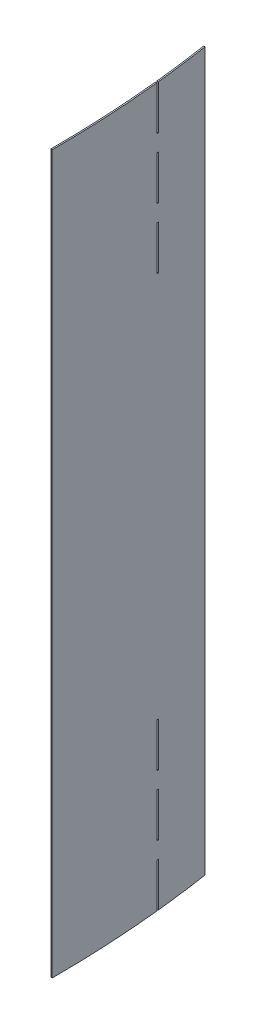
ISO-10303-21;
HEADER;
FILE_DESCRIPTION(('STEP AP214'),'2;1');
FILE_NAME('part.step','',(''),(''),'','','');
FILE_SCHEMA(('AUTOMOTIVE_DESIGN { 1 0 10303 214 1 1 1 1 }'));
ENDSEC;
DATA;
#1=APPLICATION_CONTEXT('core data for automotive mechanical design processes');
#2=APPLICATION_PROTOCOL_DEFINITION('international standard','automotive_design',2000,#1);
#3=PRODUCT_CONTEXT('',#1,'mechanical');
#4=PRODUCT('Part','Part','',(#3));
#5=PRODUCT_RELATED_PRODUCT_CATEGORY('part','',(#4));
#6=PRODUCT_DEFINITION_FORMATION('','',#4);
#7=PRODUCT_DEFINITION_CONTEXT('part definition',#1,'design');
#8=PRODUCT_DEFINITION('design','',#6,#7);
#9=PRODUCT_DEFINITION_SHAPE('','',#8);
#10=(LENGTH_UNIT() NAMED_UNIT(*) SI_UNIT(.MILLI.,.METRE.));
#11=(NAMED_UNIT(*) PLANE_ANGLE_UNIT() SI_UNIT($,.RADIAN.));
#12=(NAMED_UNIT(*) SI_UNIT($,.STERADIAN.) SOLID_ANGLE_UNIT());
#13=UNCERTAINTY_MEASURE_WITH_UNIT(LENGTH_MEASURE(1.E-05),#10,'distance_accuracy_value','');
#14=(GEOMETRIC_REPRESENTATION_CONTEXT(3) GLOBAL_UNCERTAINTY_ASSIGNED_CONTEXT((#13)) GLOBAL_UNIT_ASSIGNED_CONTEXT((#10,
#11,#12)) REPRESENTATION_CONTEXT('',''));
#15=CARTESIAN_POINT('',(0.,0.,0.));
#16=DIRECTION('',(0.,0.,1.));
#17=DIRECTION('',(1.,0.,0.));
#18=AXIS2_PLACEMENT_3D('',#15,#16,#17);
#19=CARTESIAN_POINT('',(194.448352042331,115.,-20.2506392003287));
#20=DIRECTION('',(-0.103583832226745,0.,-0.994620726559236));
#21=DIRECTION('',(0.,1.,0.));
#22=AXIS2_PLACEMENT_3D('',#19,#20,#21);
#23=PLANE('',#22);
#24=DIRECTION('',(-0.994620726559236,0.,0.103583832226745));
#25=VECTOR('',#24,1.);
#26=CARTESIAN_POINT('',(194.448352042331,111.,-20.2506392003287));
#27=LINE('',#26,#25);
#28=CARTESIAN_POINT('',(194.69700722397,111.,-20.2765351583854));
#29=VERTEX_POINT('',#28);
#30=CARTESIAN_POINT('',(194.448352042331,111.,-20.2506392003287));
#31=VERTEX_POINT('',#30);
#32=EDGE_CURVE('E11',#29,#31,#27,.T.);
#33=ORIENTED_EDGE('',*,*,#32,.F.);
#34=DIRECTION('',(0.,-1.,0.));
#35=VECTOR('',#34,1.);
#36=CARTESIAN_POINT('',(194.69700722397,198.448032274868,-20.2765351583854));
#37=LINE('',#36,#35);
#38=CARTESIAN_POINT('',(194.69700722397,119.,-20.2765351583854));
#39=VERTEX_POINT('',#38);
#40=EDGE_CURVE('E147',#29,#39,#37,.F.);
#41=ORIENTED_EDGE('',*,*,#40,.T.);
#42=DIRECTION('',(-0.994620726559236,0.,0.103583832226745));
#43=VECTOR('',#42,1.);
#44=CARTESIAN_POINT('',(194.448352042331,119.,-20.2506392003287));
#45=LINE('',#44,#43);
#46=CARTESIAN_POINT('',(194.448352042331,119.,-20.2506392003287));
#47=VERTEX_POINT('',#46);
#48=EDGE_CURVE('E49',#39,#47,#45,.T.);
#49=ORIENTED_EDGE('',*,*,#48,.T.);
#50=DIRECTION('',(0.,1.,0.));
#51=VECTOR('',#50,1.);
#52=CARTESIAN_POINT('',(194.448352042331,119.,-20.2506392003287));
#53=LINE('',#52,#51);
#54=EDGE_CURVE('E150',#31,#47,#53,.T.);
#55=ORIENTED_EDGE('',*,*,#54,.F.);
#56=EDGE_LOOP('',(#33,#41,#49,#55));
#57=FACE_BOUND('',#56,.T.);
#58=ADVANCED_FACE('F39',(#57),#23,.F.);
#59=CARTESIAN_POINT('',(0.,119.,0.));
#60=DIRECTION('',(0.,1.,0.));
#61=DIRECTION('',(0.,0.,1.));
#62=AXIS2_PLACEMENT_3D('',#59,#60,#61);
#63=PLANE('',#62);
#64=ORIENTED_EDGE('',*,*,#48,.F.);
#65=CARTESIAN_POINT('',(0.,119.,0.));
#66=DIRECTION('',(0.,-1.,0.));
#67=DIRECTION('',(0.,0.,-1.));
#68=AXIS2_PLACEMENT_3D('',#65,#66,#67);
#69=CIRCLE('',#68,195.75);
#70=CARTESIAN_POINT('',(194.727873277082,119.,-19.9779345525165));
#71=VERTEX_POINT('',#70);
#72=EDGE_CURVE('E162',#39,#71,#69,.T.);
#73=ORIENTED_EDGE('',*,*,#72,.T.);
#74=DIRECTION('',(-0.994778407545758,0.,0.102058414061387));
#75=VECTOR('',#74,1.);
#76=CARTESIAN_POINT('',(194.479178675196,119.,-19.9524199490011));
#77=LINE('',#76,#75);
#78=CARTESIAN_POINT('',(194.479178675196,119.,-19.9524199490011));
#79=VERTEX_POINT('',#78);
#80=EDGE_CURVE('E247',#71,#79,#77,.T.);
#81=ORIENTED_EDGE('',*,*,#80,.T.);
#82=CARTESIAN_POINT('',(0.,119.,0.));
#83=DIRECTION('',(0.,-1.,0.));
#84=DIRECTION('',(0.,0.,1.));
#85=AXIS2_PLACEMENT_3D('',#82,#83,#84);
#86=CIRCLE('',#85,195.5);
#87=EDGE_CURVE('E254',#47,#79,#86,.T.);
#88=ORIENTED_EDGE('',*,*,#87,.F.);
#89=EDGE_LOOP('',(#64,#73,#81,#88));
#90=FACE_BOUND('',#89,.T.);
#91=ADVANCED_FACE('F257',(#90),#63,.F.);
#92=CARTESIAN_POINT('',(194.479178675196,115.,-19.9524199490011));
#93=DIRECTION('',(0.102058414061387,0.,0.994778407545758));
#94=DIRECTION('',(0.,-1.,0.));
#95=AXIS2_PLACEMENT_3D('',#92,#93,#94);
#96=PLANE('',#95);
#97=ORIENTED_EDGE('',*,*,#80,.F.);
#98=DIRECTION('',(0.,-1.,0.));
#99=VECTOR('',#98,1.);
#100=CARTESIAN_POINT('',(194.727873277082,198.448032274868,-19.9779345525165));
#101=LINE('',#100,#99);
#102=CARTESIAN_POINT('',(194.727873277082,111.,-19.9779345525165));
#103=VERTEX_POINT('',#102);
#104=EDGE_CURVE('E166',#71,#103,#101,.T.);
#105=ORIENTED_EDGE('',*,*,#104,.T.);
#106=DIRECTION('',(-0.994778407545758,0.,0.102058414061387));
#107=VECTOR('',#106,1.);
#108=CARTESIAN_POINT('',(194.479178675196,111.,-19.9524199490011));
#109=LINE('',#108,#107);
#110=CARTESIAN_POINT('',(194.479178675196,111.,-19.9524199490011));
#111=VERTEX_POINT('',#110);
#112=EDGE_CURVE('E43',#103,#111,#109,.T.);
#113=ORIENTED_EDGE('',*,*,#112,.T.);
#114=DIRECTION('',(0.,-1.,0.));
#115=VECTOR('',#114,1.);
#116=CARTESIAN_POINT('',(194.479178675196,111.,-19.9524199490011));
#117=LINE('',#116,#115);
#118=EDGE_CURVE('E258',#79,#111,#117,.T.);
#119=ORIENTED_EDGE('',*,*,#118,.F.);
#120=EDGE_LOOP('',(#97,#105,#113,#119));
#121=FACE_BOUND('',#120,.T.);
#122=ADVANCED_FACE('F509',(#121),#96,.F.);
#123=CARTESIAN_POINT('',(194.448352042331,104.,-20.2506392003287));
#124=DIRECTION('',(-0.103583832226745,0.,-0.994620726559236));
#125=DIRECTION('',(0.,1.,0.));
#126=AXIS2_PLACEMENT_3D('',#123,#124,#125);
#127=PLANE('',#126);
#128=DIRECTION('',(-0.994620726559236,0.,0.103583832226745));
#129=VECTOR('',#128,1.);
#130=CARTESIAN_POINT('',(194.448352042331,100.,-20.2506392003287));
#131=LINE('',#130,#129);
#132=CARTESIAN_POINT('',(194.69700722397,100.,-20.2765351583854));
#133=VERTEX_POINT('',#132);
#134=CARTESIAN_POINT('',(194.448352042331,100.,-20.2506392003287));
#135=VERTEX_POINT('',#134);
#136=EDGE_CURVE('E242',#133,#135,#131,.T.);
#137=ORIENTED_EDGE('',*,*,#136,.F.);
#138=DIRECTION('',(0.,-1.,0.));
#139=VECTOR('',#138,1.);
#140=CARTESIAN_POINT('',(194.69700722397,198.448032274868,-20.2765351583854));
#141=LINE('',#140,#139);
#142=CARTESIAN_POINT('',(194.69700722397,108.,-20.2765351583854));
#143=VERTEX_POINT('',#142);
#144=EDGE_CURVE('E324',#133,#143,#141,.F.);
#145=ORIENTED_EDGE('',*,*,#144,.T.);
#146=DIRECTION('',(-0.994620726559236,0.,0.103583832226745));
#147=VECTOR('',#146,1.);
#148=CARTESIAN_POINT('',(194.448352042331,108.,-20.2506392003287));
#149=LINE('',#148,#147);
#150=CARTESIAN_POINT('',(194.448352042331,108.,-20.2506392003287));
#151=VERTEX_POINT('',#150);
#152=EDGE_CURVE('E239',#143,#151,#149,.T.);
#153=ORIENTED_EDGE('',*,*,#152,.T.);
#154=DIRECTION('',(0.,1.,0.));
#155=VECTOR('',#154,1.);
#156=CARTESIAN_POINT('',(194.448352042331,108.,-20.2506392003287));
#157=LINE('',#156,#155);
#158=EDGE_CURVE('E348',#135,#151,#157,.T.);
#159=ORIENTED_EDGE('',*,*,#158,.F.);
#160=EDGE_LOOP('',(#137,#145,#153,#159));
#161=FACE_BOUND('',#160,.T.);
#162=ADVANCED_FACE('F345',(#161),#127,.F.);
#163=CARTESIAN_POINT('',(0.,108.,0.));
#164=DIRECTION('',(0.,1.,0.));
#165=DIRECTION('',(0.,0.,1.));
#166=AXIS2_PLACEMENT_3D('',#163,#164,#165);
#167=PLANE('',#166);
#168=ORIENTED_EDGE('',*,*,#152,.F.);
#169=CARTESIAN_POINT('',(0.,108.,0.));
#170=DIRECTION('',(0.,-1.,0.));
#171=DIRECTION('',(0.,0.,-1.));
#172=AXIS2_PLACEMENT_3D('',#169,#170,#171);
#173=CIRCLE('',#172,195.75);
#174=CARTESIAN_POINT('',(194.727873277082,108.,-19.9779345525165));
#175=VERTEX_POINT('',#174);
#176=EDGE_CURVE('E328',#143,#175,#173,.T.);
#177=ORIENTED_EDGE('',*,*,#176,.T.);
#178=DIRECTION('',(-0.994778407545758,0.,0.102058414061387));
#179=VECTOR('',#178,1.);
#180=CARTESIAN_POINT('',(194.479178675196,108.,-19.9524199490011));
#181=LINE('',#180,#179);
#182=CARTESIAN_POINT('',(194.479178675196,108.,-19.9524199490011));
#183=VERTEX_POINT('',#182);
#184=EDGE_CURVE('E236',#175,#183,#181,.T.);
#185=ORIENTED_EDGE('',*,*,#184,.T.);
#186=CARTESIAN_POINT('',(0.,108.,0.));
#187=DIRECTION('',(0.,-1.,0.));
#188=DIRECTION('',(0.,0.,1.));
#189=AXIS2_PLACEMENT_3D('',#186,#187,#188);
#190=CIRCLE('',#189,195.5);
#191=EDGE_CURVE('E355',#151,#183,#190,.T.);
#192=ORIENTED_EDGE('',*,*,#191,.F.);
#193=EDGE_LOOP('',(#168,#177,#185,#192));
#194=FACE_BOUND('',#193,.T.);
#195=ADVANCED_FACE('F519',(#194),#167,.F.);
#196=CARTESIAN_POINT('',(194.479178675196,104.,-19.9524199490011));
#197=DIRECTION('',(0.102058414061387,0.,0.994778407545758));
#198=DIRECTION('',(0.,-1.,0.));
#199=AXIS2_PLACEMENT_3D('',#196,#197,#198);
#200=PLANE('',#199);
#201=ORIENTED_EDGE('',*,*,#184,.F.);
#202=DIRECTION('',(0.,-1.,0.));
#203=VECTOR('',#202,1.);
#204=CARTESIAN_POINT('',(194.727873277082,198.448032274868,-19.9779345525165));
#205=LINE('',#204,#203);
#206=CARTESIAN_POINT('',(194.727873277082,100.,-19.9779345525165));
#207=VERTEX_POINT('',#206);
#208=EDGE_CURVE('E325',#175,#207,#205,.T.);
#209=ORIENTED_EDGE('',*,*,#208,.T.);
#210=DIRECTION('',(-0.994778407545758,0.,0.102058414061387));
#211=VECTOR('',#210,1.);
#212=CARTESIAN_POINT('',(194.479178675196,100.,-19.9524199490011));
#213=LINE('',#212,#211);
#214=CARTESIAN_POINT('',(194.479178675196,100.,-19.9524199490011));
#215=VERTEX_POINT('',#214);
#216=EDGE_CURVE('E233',#207,#215,#213,.T.);
#217=ORIENTED_EDGE('',*,*,#216,.T.);
#218=DIRECTION('',(0.,-1.,0.));
#219=VECTOR('',#218,1.);
#220=CARTESIAN_POINT('',(194.479178675196,100.,-19.9524199490011));
#221=LINE('',#220,#219);
#222=EDGE_CURVE('E361',#183,#215,#221,.T.);
#223=ORIENTED_EDGE('',*,*,#222,.F.);
#224=EDGE_LOOP('',(#201,#209,#217,#223));
#225=FACE_BOUND('',#224,.T.);
#226=ADVANCED_FACE('F522',(#225),#200,.F.);
#227=CARTESIAN_POINT('',(194.448352042331,26.,-20.2506392003287));
#228=DIRECTION('',(-0.103583832226745,0.,-0.994620726559236));
#229=DIRECTION('',(0.,1.,0.));
#230=AXIS2_PLACEMENT_3D('',#227,#228,#229);
#231=PLANE('',#230);
#232=DIRECTION('',(-0.994620726559236,0.,0.103583832226745));
#233=VECTOR('',#232,1.);
#234=CARTESIAN_POINT('',(194.448352042331,22.,-20.2506392003287));
#235=LINE('',#234,#233);
#236=CARTESIAN_POINT('',(194.69700722397,22.,-20.2765351583854));
#237=VERTEX_POINT('',#236);
#238=CARTESIAN_POINT('',(194.448352042331,22.,-20.2506392003287));
#239=VERTEX_POINT('',#238);
#240=EDGE_CURVE('E230',#237,#239,#235,.T.);
#241=ORIENTED_EDGE('',*,*,#240,.F.);
#242=DIRECTION('',(0.,-1.,0.));
#243=VECTOR('',#242,1.);
#244=CARTESIAN_POINT('',(194.69700722397,198.448032274868,-20.2765351583854));
#245=LINE('',#244,#243);
#246=CARTESIAN_POINT('',(194.69700722397,30.,-20.2765351583854));
#247=VERTEX_POINT('',#246);
#248=EDGE_CURVE('E312',#237,#247,#245,.F.);
#249=ORIENTED_EDGE('',*,*,#248,.T.);
#250=DIRECTION('',(-0.994620726559236,0.,0.103583832226745));
#251=VECTOR('',#250,1.);
#252=CARTESIAN_POINT('',(194.448352042331,30.,-20.2506392003287));
#253=LINE('',#252,#251);
#254=CARTESIAN_POINT('',(194.448352042331,30.,-20.2506392003287));
#255=VERTEX_POINT('',#254);
#256=EDGE_CURVE('E227',#247,#255,#253,.T.);
#257=ORIENTED_EDGE('',*,*,#256,.T.);
#258=DIRECTION('',(0.,1.,0.));
#259=VECTOR('',#258,1.);
#260=CARTESIAN_POINT('',(194.448352042331,30.,-20.2506392003287));
#261=LINE('',#260,#259);
#262=EDGE_CURVE('E373',#239,#255,#261,.T.);
#263=ORIENTED_EDGE('',*,*,#262,.F.);
#264=EDGE_LOOP('',(#241,#249,#257,#263));
#265=FACE_BOUND('',#264,.T.);
#266=ADVANCED_FACE('F526',(#265),#231,.F.);
#267=CARTESIAN_POINT('',(0.,30.,0.));
#268=DIRECTION('',(0.,1.,0.));
#269=DIRECTION('',(0.,0.,1.));
#270=AXIS2_PLACEMENT_3D('',#267,#268,#269);
#271=PLANE('',#270);
#272=ORIENTED_EDGE('',*,*,#256,.F.);
#273=CARTESIAN_POINT('',(0.,30.,0.));
#274=DIRECTION('',(0.,-1.,0.));
#275=DIRECTION('',(0.,0.,-1.));
#276=AXIS2_PLACEMENT_3D('',#273,#274,#275);
#277=CIRCLE('',#276,195.75);
#278=CARTESIAN_POINT('',(194.727873277082,30.,-19.9779345525165));
#279=VERTEX_POINT('',#278);
#280=EDGE_CURVE('E317',#247,#279,#277,.T.);
#281=ORIENTED_EDGE('',*,*,#280,.T.);
#282=DIRECTION('',(-0.994778407545758,0.,0.102058414061387));
#283=VECTOR('',#282,1.);
#284=CARTESIAN_POINT('',(194.479178675196,30.,-19.9524199490011));
#285=LINE('',#284,#283);
#286=CARTESIAN_POINT('',(194.479178675196,30.,-19.9524199490011));
#287=VERTEX_POINT('',#286);
#288=EDGE_CURVE('E224',#279,#287,#285,.T.);
#289=ORIENTED_EDGE('',*,*,#288,.T.);
#290=CARTESIAN_POINT('',(0.,30.,0.));
#291=DIRECTION('',(0.,-1.,0.));
#292=DIRECTION('',(0.,0.,1.));
#293=AXIS2_PLACEMENT_3D('',#290,#291,#292);
#294=CIRCLE('',#293,195.5);
#295=EDGE_CURVE('E370',#255,#287,#294,.T.);
#296=ORIENTED_EDGE('',*,*,#295,.F.);
#297=EDGE_LOOP('',(#272,#281,#289,#296));
#298=FACE_BOUND('',#297,.T.);
#299=ADVANCED_FACE('F534',(#298),#271,.F.);
#300=CARTESIAN_POINT('',(194.479178675196,26.,-19.9524199490011));
#301=DIRECTION('',(0.102058414061387,0.,0.994778407545758));
#302=DIRECTION('',(0.,-1.,0.));
#303=AXIS2_PLACEMENT_3D('',#300,#301,#302);
#304=PLANE('',#303);
#305=ORIENTED_EDGE('',*,*,#288,.F.);
#306=DIRECTION('',(0.,-1.,0.));
#307=VECTOR('',#306,1.);
#308=CARTESIAN_POINT('',(194.727873277082,198.448032274868,-19.9779345525165));
#309=LINE('',#308,#307);
#310=CARTESIAN_POINT('',(194.727873277082,22.,-19.9779345525165));
#311=VERTEX_POINT('',#310);
#312=EDGE_CURVE('E313',#279,#311,#309,.T.);
#313=ORIENTED_EDGE('',*,*,#312,.T.);
#314=DIRECTION('',(-0.994778407545758,0.,0.102058414061387));
#315=VECTOR('',#314,1.);
#316=CARTESIAN_POINT('',(194.479178675196,22.,-19.9524199490011));
#317=LINE('',#316,#315);
#318=CARTESIAN_POINT('',(194.479178675196,22.,-19.9524199490011));
#319=VERTEX_POINT('',#318);
#320=EDGE_CURVE('E221',#311,#319,#317,.T.);
#321=ORIENTED_EDGE('',*,*,#320,.T.);
#322=DIRECTION('',(0.,-1.,0.));
#323=VECTOR('',#322,1.);
#324=CARTESIAN_POINT('',(194.479178675196,22.,-19.9524199490011));
#325=LINE('',#324,#323);
#326=EDGE_CURVE('E367',#287,#319,#325,.T.);
#327=ORIENTED_EDGE('',*,*,#326,.F.);
#328=EDGE_LOOP('',(#305,#313,#321,#327));
#329=FACE_BOUND('',#328,.T.);
#330=ADVANCED_FACE('F538',(#329),#304,.F.);
#331=CARTESIAN_POINT('',(194.448352042331,15.,-20.2506392003287));
#332=DIRECTION('',(-0.103583832226745,0.,-0.994620726559236));
#333=DIRECTION('',(0.,1.,0.));
#334=AXIS2_PLACEMENT_3D('',#331,#332,#333);
#335=PLANE('',#334);
#336=DIRECTION('',(-0.994620726559236,0.,0.103583832226745));
#337=VECTOR('',#336,1.);
#338=CARTESIAN_POINT('',(194.448352042331,11.,-20.2506392003287));
#339=LINE('',#338,#337);
#340=CARTESIAN_POINT('',(194.69700722397,11.,-20.2765351583854));
#341=VERTEX_POINT('',#340);
#342=CARTESIAN_POINT('',(194.448352042331,11.,-20.2506392003287));
#343=VERTEX_POINT('',#342);
#344=EDGE_CURVE('E218',#341,#343,#339,.T.);
#345=ORIENTED_EDGE('',*,*,#344,.F.);
#346=DIRECTION('',(0.,-1.,0.));
#347=VECTOR('',#346,1.);
#348=CARTESIAN_POINT('',(194.69700722397,198.448032274868,-20.2765351583854));
#349=LINE('',#348,#347);
#350=CARTESIAN_POINT('',(194.69700722397,19.,-20.2765351583854));
#351=VERTEX_POINT('',#350);
#352=EDGE_CURVE('E300',#341,#351,#349,.F.);
#353=ORIENTED_EDGE('',*,*,#352,.T.);
#354=DIRECTION('',(-0.994620726559236,0.,0.103583832226745));
#355=VECTOR('',#354,1.);
#356=CARTESIAN_POINT('',(194.448352042331,19.,-20.2506392003287));
#357=LINE('',#356,#355);
#358=CARTESIAN_POINT('',(194.448352042331,19.,-20.2506392003287));
#359=VERTEX_POINT('',#358);
#360=EDGE_CURVE('E215',#351,#359,#357,.T.);
#361=ORIENTED_EDGE('',*,*,#360,.T.);
#362=DIRECTION('',(0.,1.,0.));
#363=VECTOR('',#362,1.);
#364=CARTESIAN_POINT('',(194.448352042331,19.,-20.2506392003287));
#365=LINE('',#364,#363);
#366=EDGE_CURVE('E385',#343,#359,#365,.T.);
#367=ORIENTED_EDGE('',*,*,#366,.F.);
#368=EDGE_LOOP('',(#345,#353,#361,#367));
#369=FACE_BOUND('',#368,.T.);
#370=ADVANCED_FACE('F542',(#369),#335,.F.);
#371=CARTESIAN_POINT('',(0.,19.,0.));
#372=DIRECTION('',(0.,1.,0.));
#373=DIRECTION('',(0.,0.,1.));
#374=AXIS2_PLACEMENT_3D('',#371,#372,#373);
#375=PLANE('',#374);
#376=ORIENTED_EDGE('',*,*,#360,.F.);
#377=CARTESIAN_POINT('',(0.,19.,0.));
#378=DIRECTION('',(0.,-1.,0.));
#379=DIRECTION('',(0.,0.,-1.));
#380=AXIS2_PLACEMENT_3D('',#377,#378,#379);
#381=CIRCLE('',#380,195.75);
#382=CARTESIAN_POINT('',(194.727873277082,19.,-19.9779345525165));
#383=VERTEX_POINT('',#382);
#384=EDGE_CURVE('E305',#351,#383,#381,.T.);
#385=ORIENTED_EDGE('',*,*,#384,.T.);
#386=DIRECTION('',(-0.994778407545758,0.,0.102058414061387));
#387=VECTOR('',#386,1.);
#388=CARTESIAN_POINT('',(194.479178675196,19.,-19.9524199490011));
#389=LINE('',#388,#387);
#390=CARTESIAN_POINT('',(194.479178675196,19.,-19.9524199490011));
#391=VERTEX_POINT('',#390);
#392=EDGE_CURVE('E212',#383,#391,#389,.T.);
#393=ORIENTED_EDGE('',*,*,#392,.T.);
#394=CARTESIAN_POINT('',(0.,19.,0.));
#395=DIRECTION('',(0.,-1.,0.));
#396=DIRECTION('',(0.,0.,1.));
#397=AXIS2_PLACEMENT_3D('',#394,#395,#396);
#398=CIRCLE('',#397,195.5);
#399=EDGE_CURVE('E382',#359,#391,#398,.T.);
#400=ORIENTED_EDGE('',*,*,#399,.F.);
#401=EDGE_LOOP('',(#376,#385,#393,#400));
#402=FACE_BOUND('',#401,.T.);
#403=ADVANCED_FACE('F549',(#402),#375,.F.);
#404=CARTESIAN_POINT('',(194.479178675196,15.,-19.9524199490011));
#405=DIRECTION('',(0.102058414061387,0.,0.994778407545758));
#406=DIRECTION('',(0.,-1.,0.));
#407=AXIS2_PLACEMENT_3D('',#404,#405,#406);
#408=PLANE('',#407);
#409=ORIENTED_EDGE('',*,*,#392,.F.);
#410=DIRECTION('',(0.,-1.,0.));
#411=VECTOR('',#410,1.);
#412=CARTESIAN_POINT('',(194.727873277082,198.448032274868,-19.9779345525165));
#413=LINE('',#412,#411);
#414=CARTESIAN_POINT('',(194.727873277082,11.,-19.9779345525165));
#415=VERTEX_POINT('',#414);
#416=EDGE_CURVE('E301',#383,#415,#413,.T.);
#417=ORIENTED_EDGE('',*,*,#416,.T.);
#418=DIRECTION('',(-0.994778407545758,0.,0.102058414061387));
#419=VECTOR('',#418,1.);
#420=CARTESIAN_POINT('',(194.479178675196,11.,-19.9524199490011));
#421=LINE('',#420,#419);
#422=CARTESIAN_POINT('',(194.479178675196,11.,-19.9524199490011));
#423=VERTEX_POINT('',#422);
#424=EDGE_CURVE('E208',#415,#423,#421,.T.);
#425=ORIENTED_EDGE('',*,*,#424,.T.);
#426=DIRECTION('',(0.,-1.,0.));
#427=VECTOR('',#426,1.);
#428=CARTESIAN_POINT('',(194.479178675196,11.,-19.9524199490011));
#429=LINE('',#428,#427);
#430=EDGE_CURVE('E379',#391,#423,#429,.T.);
#431=ORIENTED_EDGE('',*,*,#430,.F.);
#432=EDGE_LOOP('',(#409,#417,#425,#431));
#433=FACE_BOUND('',#432,.T.);
#434=ADVANCED_FACE('F503',(#433),#408,.F.);
#435=CARTESIAN_POINT('',(194.448352042331,4.,-20.2506392003287));
#436=DIRECTION('',(-0.103583832226745,0.,-0.994620726559236));
#437=DIRECTION('',(0.,1.,0.));
#438=AXIS2_PLACEMENT_3D('',#435,#436,#437);
#439=PLANE('',#438);
#440=DIRECTION('',(-0.994620726559236,0.,0.103583832226745));
#441=VECTOR('',#440,1.);
#442=CARTESIAN_POINT('',(194.448352042331,0.,-20.2506392003287));
#443=LINE('',#442,#441);
#444=CARTESIAN_POINT('',(194.69700722397,0.,-20.2765351583854));
#445=VERTEX_POINT('',#444);
#446=CARTESIAN_POINT('',(194.448352042331,0.,-20.2506392003287));
#447=VERTEX_POINT('',#446);
#448=EDGE_CURVE('E205',#445,#447,#443,.T.);
#449=ORIENTED_EDGE('',*,*,#448,.F.);
#450=DIRECTION('',(0.,-1.,0.));
#451=VECTOR('',#450,1.);
#452=CARTESIAN_POINT('',(194.69700722397,198.448032274868,-20.2765351583854));
#453=LINE('',#452,#451);
#454=CARTESIAN_POINT('',(194.69700722397,8.00000000000001,-20.2765351583854));
#455=VERTEX_POINT('',#454);
#456=EDGE_CURVE('E295',#445,#455,#453,.F.);
#457=ORIENTED_EDGE('',*,*,#456,.T.);
#458=DIRECTION('',(-0.994620726559236,0.,0.103583832226745));
#459=VECTOR('',#458,1.);
#460=CARTESIAN_POINT('',(194.448352042331,8.00000000000001,-20.2506392003287));
#461=LINE('',#460,#459);
#462=CARTESIAN_POINT('',(194.448352042331,8.00000000000001,-20.2506392003287));
#463=VERTEX_POINT('',#462);
#464=EDGE_CURVE('E202',#455,#463,#461,.T.);
#465=ORIENTED_EDGE('',*,*,#464,.T.);
#466=DIRECTION('',(0.,1.,0.));
#467=VECTOR('',#466,1.);
#468=CARTESIAN_POINT('',(194.448352042331,8.00000000000001,-20.2506392003287));
#469=LINE('',#468,#467);
#470=EDGE_CURVE('E165',#447,#463,#469,.T.);
#471=ORIENTED_EDGE('',*,*,#470,.F.);
#472=EDGE_LOOP('',(#449,#457,#465,#471));
#473=FACE_BOUND('',#472,.T.);
#474=ADVANCED_FACE('F493',(#473),#439,.F.);
#475=CARTESIAN_POINT('',(0.,8.00000000000001,0.));
#476=DIRECTION('',(0.,1.,0.));
#477=DIRECTION('',(0.,0.,1.));
#478=AXIS2_PLACEMENT_3D('',#475,#476,#477);
#479=PLANE('',#478);
#480=ORIENTED_EDGE('',*,*,#464,.F.);
#481=CARTESIAN_POINT('',(0.,8.00000000000001,0.));
#482=DIRECTION('',(0.,-1.,0.));
#483=DIRECTION('',(0.,0.,-1.));
#484=AXIS2_PLACEMENT_3D('',#481,#482,#483);
#485=CIRCLE('',#484,195.75);
#486=CARTESIAN_POINT('',(194.727873277082,8.00000000000001,-19.9779345525165));
#487=VERTEX_POINT('',#486);
#488=EDGE_CURVE('E292',#455,#487,#485,.T.);
#489=ORIENTED_EDGE('',*,*,#488,.T.);
#490=DIRECTION('',(-0.994778407545758,0.,0.102058414061387));
#491=VECTOR('',#490,1.);
#492=CARTESIAN_POINT('',(194.479178675196,8.00000000000001,-19.9524199490011));
#493=LINE('',#492,#491);
#494=CARTESIAN_POINT('',(194.479178675196,8.00000000000001,-19.9524199490011));
#495=VERTEX_POINT('',#494);
#496=EDGE_CURVE('E199',#487,#495,#493,.T.);
#497=ORIENTED_EDGE('',*,*,#496,.T.);
#498=CARTESIAN_POINT('',(0.,8.00000000000001,0.));
#499=DIRECTION('',(0.,-1.,0.));
#500=DIRECTION('',(0.,0.,1.));
#501=AXIS2_PLACEMENT_3D('',#498,#499,#500);
#502=CIRCLE('',#501,195.5);
#503=EDGE_CURVE('E169',#463,#495,#502,.T.);
#504=ORIENTED_EDGE('',*,*,#503,.F.);
#505=EDGE_LOOP('',(#480,#489,#497,#504));
#506=FACE_BOUND('',#505,.T.);
#507=ADVANCED_FACE('F495',(#506),#479,.F.);
#508=CARTESIAN_POINT('',(194.479178675196,4.,-19.9524199490011));
#509=DIRECTION('',(0.102058414061387,0.,0.994778407545758));
#510=DIRECTION('',(0.,-1.,0.));
#511=AXIS2_PLACEMENT_3D('',#508,#509,#510);
#512=PLANE('',#511);
#513=ORIENTED_EDGE('',*,*,#496,.F.);
#514=DIRECTION('',(0.,-1.,0.));
#515=VECTOR('',#514,1.);
#516=CARTESIAN_POINT('',(194.727873277082,198.448032274868,-19.9779345525165));
#517=LINE('',#516,#515);
#518=CARTESIAN_POINT('',(194.727873277082,0.,-19.9779345525165));
#519=VERTEX_POINT('',#518);
#520=EDGE_CURVE('E289',#487,#519,#517,.T.);
#521=ORIENTED_EDGE('',*,*,#520,.T.);
#522=DIRECTION('',(-0.994778407545758,0.,0.102058414061387));
#523=VECTOR('',#522,1.);
#524=CARTESIAN_POINT('',(194.479178675196,0.,-19.9524199490011));
#525=LINE('',#524,#523);
#526=CARTESIAN_POINT('',(194.479178675196,0.,-19.9524199490011));
#527=VERTEX_POINT('',#526);
#528=EDGE_CURVE('E196',#519,#527,#525,.T.);
#529=ORIENTED_EDGE('',*,*,#528,.T.);
#530=DIRECTION('',(0.,-1.,0.));
#531=VECTOR('',#530,1.);
#532=CARTESIAN_POINT('',(194.479178675196,0.,-19.9524199490011));
#533=LINE('',#532,#531);
#534=EDGE_CURVE('E415',#495,#527,#533,.T.);
#535=ORIENTED_EDGE('',*,*,#534,.F.);
#536=EDGE_LOOP('',(#513,#521,#529,#535));
#537=FACE_BOUND('',#536,.T.);
#538=ADVANCED_FACE('F431',(#537),#512,.F.);
#539=CARTESIAN_POINT('',(0.,0.,0.));
#540=DIRECTION('',(0.,1.,0.));
#541=DIRECTION('',(0.,0.,1.));
#542=AXIS2_PLACEMENT_3D('',#539,#540,#541);
#543=PLANE('',#542);
#544=ORIENTED_EDGE('',*,*,#528,.F.);
#545=CARTESIAN_POINT('',(0.,0.,0.));
#546=DIRECTION('',(0.,-1.,0.));
#547=DIRECTION('',(0.,0.,-1.));
#548=AXIS2_PLACEMENT_3D('',#545,#546,#547);
#549=CIRCLE('',#548,195.75);
#550=CARTESIAN_POINT('',(195.75,0.,0.));
#551=VERTEX_POINT('',#550);
#552=EDGE_CURVE('E286',#519,#551,#549,.T.);
#553=ORIENTED_EDGE('',*,*,#552,.T.);
#554=DIRECTION('',(-1.,0.,0.));
#555=VECTOR('',#554,1.);
#556=CARTESIAN_POINT('',(195.5,0.,0.));
#557=LINE('',#556,#555);
#558=CARTESIAN_POINT('',(195.5,0.,0.));
#559=VERTEX_POINT('',#558);
#560=EDGE_CURVE('E193',#551,#559,#557,.T.);
#561=ORIENTED_EDGE('',*,*,#560,.T.);
#562=CARTESIAN_POINT('',(0.,0.,0.));
#563=DIRECTION('',(0.,-1.,0.));
#564=DIRECTION('',(0.,0.,-1.));
#565=AXIS2_PLACEMENT_3D('',#562,#563,#564);
#566=CIRCLE('',#565,195.5);
#567=EDGE_CURVE('E412',#527,#559,#566,.T.);
#568=ORIENTED_EDGE('',*,*,#567,.F.);
#569=EDGE_LOOP('',(#544,#553,#561,#568));
#570=FACE_BOUND('',#569,.T.);
#571=ADVANCED_FACE('F437',(#570),#543,.F.);
#572=CARTESIAN_POINT('',(195.5,65.,0.));
#573=DIRECTION('',(0.,0.,-1.));
#574=DIRECTION('',(0.,1.,0.));
#575=AXIS2_PLACEMENT_3D('',#572,#573,#574);
#576=PLANE('',#575);
#577=ORIENTED_EDGE('',*,*,#560,.F.);
#578=DIRECTION('',(0.,-1.,0.));
#579=VECTOR('',#578,1.);
#580=CARTESIAN_POINT('',(195.75,198.448032274868,0.));
#581=LINE('',#580,#579);
#582=CARTESIAN_POINT('',(195.75,130.,0.));
#583=VERTEX_POINT('',#582);
#584=EDGE_CURVE('E283',#551,#583,#581,.F.);
#585=ORIENTED_EDGE('',*,*,#584,.T.);
#586=DIRECTION('',(-1.,0.,0.));
#587=VECTOR('',#586,1.);
#588=CARTESIAN_POINT('',(195.5,130.,0.));
#589=LINE('',#588,#587);
#590=CARTESIAN_POINT('',(195.5,130.,0.));
#591=VERTEX_POINT('',#590);
#592=EDGE_CURVE('E190',#583,#591,#589,.T.);
#593=ORIENTED_EDGE('',*,*,#592,.T.);
#594=DIRECTION('',(0.,1.,0.));
#595=VECTOR('',#594,1.);
#596=CARTESIAN_POINT('',(195.5,0.,0.));
#597=LINE('',#596,#595);
#598=EDGE_CURVE('E409',#559,#591,#597,.T.);
#599=ORIENTED_EDGE('',*,*,#598,.F.);
#600=EDGE_LOOP('',(#577,#585,#593,#599));
#601=FACE_BOUND('',#600,.T.);
#602=ADVANCED_FACE('F446',(#601),#576,.F.);
#603=CARTESIAN_POINT('',(0.,130.,0.));
#604=DIRECTION('',(0.,-1.,0.));
#605=DIRECTION('',(0.,0.,-1.));
#606=AXIS2_PLACEMENT_3D('',#603,#604,#605);
#607=PLANE('',#606);
#608=ORIENTED_EDGE('',*,*,#592,.F.);
#609=CARTESIAN_POINT('',(0.,130.,0.));
#610=DIRECTION('',(0.,-1.,0.));
#611=DIRECTION('',(0.,0.,-1.));
#612=AXIS2_PLACEMENT_3D('',#609,#610,#611);
#613=CIRCLE('',#612,195.75);
#614=CARTESIAN_POINT('',(194.727873277082,130.,-19.9779345525165));
#615=VERTEX_POINT('',#614);
#616=EDGE_CURVE('E280',#583,#615,#613,.F.);
#617=ORIENTED_EDGE('',*,*,#616,.T.);
#618=DIRECTION('',(-0.994778407545758,0.,0.102058414061387));
#619=VECTOR('',#618,1.);
#620=CARTESIAN_POINT('',(194.479178675196,130.,-19.9524199490012));
#621=LINE('',#620,#619);
#622=CARTESIAN_POINT('',(194.479178675196,130.,-19.9524199490012));
#623=VERTEX_POINT('',#622);
#624=EDGE_CURVE('E187',#615,#623,#621,.T.);
#625=ORIENTED_EDGE('',*,*,#624,.T.);
#626=CARTESIAN_POINT('',(0.,130.,0.));
#627=DIRECTION('',(0.,1.,0.));
#628=DIRECTION('',(0.,0.,1.));
#629=AXIS2_PLACEMENT_3D('',#626,#627,#628);
#630=CIRCLE('',#629,195.5);
#631=EDGE_CURVE('E406',#591,#623,#630,.T.);
#632=ORIENTED_EDGE('',*,*,#631,.F.);
#633=EDGE_LOOP('',(#608,#617,#625,#632));
#634=FACE_BOUND('',#633,.T.);
#635=ADVANCED_FACE('F455',(#634),#607,.F.);
#636=CARTESIAN_POINT('',(194.479178675196,126.,-19.9524199490011));
#637=DIRECTION('',(0.102058414061387,0.,0.994778407545758));
#638=DIRECTION('',(0.,-1.,0.));
#639=AXIS2_PLACEMENT_3D('',#636,#637,#638);
#640=PLANE('',#639);
#641=ORIENTED_EDGE('',*,*,#624,.F.);
#642=DIRECTION('',(0.,-1.,0.));
#643=VECTOR('',#642,1.);
#644=CARTESIAN_POINT('',(194.727873277082,198.448032274868,-19.9779345525165));
#645=LINE('',#644,#643);
#646=CARTESIAN_POINT('',(194.727873277082,122.,-19.9779345525165));
#647=VERTEX_POINT('',#646);
#648=EDGE_CURVE('E277',#615,#647,#645,.T.);
#649=ORIENTED_EDGE('',*,*,#648,.T.);
#650=DIRECTION('',(-0.994778407545758,0.,0.102058414061387));
#651=VECTOR('',#650,1.);
#652=CARTESIAN_POINT('',(194.479178675196,122.,-19.9524199490011));
#653=LINE('',#652,#651);
#654=CARTESIAN_POINT('',(194.479178675196,122.,-19.9524199490011));
#655=VERTEX_POINT('',#654);
#656=EDGE_CURVE('E184',#647,#655,#653,.T.);
#657=ORIENTED_EDGE('',*,*,#656,.T.);
#658=DIRECTION('',(0.,-1.,0.));
#659=VECTOR('',#658,1.);
#660=CARTESIAN_POINT('',(194.479178675196,122.,-19.9524199490011));
#661=LINE('',#660,#659);
#662=EDGE_CURVE('E403',#623,#655,#661,.T.);
#663=ORIENTED_EDGE('',*,*,#662,.F.);
#664=EDGE_LOOP('',(#641,#649,#657,#663));
#665=FACE_BOUND('',#664,.T.);
#666=ADVANCED_FACE('F459',(#665),#640,.F.);
#667=CARTESIAN_POINT('',(0.,122.,0.));
#668=DIRECTION('',(0.,-1.,0.));
#669=DIRECTION('',(0.,0.,-1.));
#670=AXIS2_PLACEMENT_3D('',#667,#668,#669);
#671=PLANE('',#670);
#672=ORIENTED_EDGE('',*,*,#656,.F.);
#673=CARTESIAN_POINT('',(0.,122.,0.));
#674=DIRECTION('',(0.,-1.,0.));
#675=DIRECTION('',(0.,0.,-1.));
#676=AXIS2_PLACEMENT_3D('',#673,#674,#675);
#677=CIRCLE('',#676,195.75);
#678=CARTESIAN_POINT('',(194.69700722397,122.,-20.2765351583854));
#679=VERTEX_POINT('',#678);
#680=EDGE_CURVE('E274',#647,#679,#677,.F.);
#681=ORIENTED_EDGE('',*,*,#680,.T.);
#682=DIRECTION('',(-0.994620726559236,0.,0.103583832226745));
#683=VECTOR('',#682,1.);
#684=CARTESIAN_POINT('',(194.448352042331,122.,-20.2506392003287));
#685=LINE('',#684,#683);
#686=CARTESIAN_POINT('',(194.448352042331,122.,-20.2506392003287));
#687=VERTEX_POINT('',#686);
#688=EDGE_CURVE('E181',#679,#687,#685,.T.);
#689=ORIENTED_EDGE('',*,*,#688,.T.);
#690=CARTESIAN_POINT('',(0.,122.,0.));
#691=DIRECTION('',(0.,1.,0.));
#692=DIRECTION('',(0.,0.,-1.));
#693=AXIS2_PLACEMENT_3D('',#690,#691,#692);
#694=CIRCLE('',#693,195.5);
#695=EDGE_CURVE('E400',#655,#687,#694,.T.);
#696=ORIENTED_EDGE('',*,*,#695,.F.);
#697=EDGE_LOOP('',(#672,#681,#689,#696));
#698=FACE_BOUND('',#697,.T.);
#699=ADVANCED_FACE('F464',(#698),#671,.F.);
#700=CARTESIAN_POINT('',(194.448352042331,126.,-20.2506392003287));
#701=DIRECTION('',(-0.103583832226745,0.,-0.994620726559236));
#702=DIRECTION('',(0.,1.,0.));
#703=AXIS2_PLACEMENT_3D('',#700,#701,#702);
#704=PLANE('',#703);
#705=ORIENTED_EDGE('',*,*,#688,.F.);
#706=DIRECTION('',(0.,-1.,0.));
#707=VECTOR('',#706,1.);
#708=CARTESIAN_POINT('',(194.69700722397,198.448032274868,-20.2765351583854));
#709=LINE('',#708,#707);
#710=CARTESIAN_POINT('',(194.69700722397,130.,-20.2765351583854));
#711=VERTEX_POINT('',#710);
#712=EDGE_CURVE('E271',#679,#711,#709,.F.);
#713=ORIENTED_EDGE('',*,*,#712,.T.);
#714=DIRECTION('',(-0.994620726559236,0.,0.103583832226745));
#715=VECTOR('',#714,1.);
#716=CARTESIAN_POINT('',(194.448352042331,130.,-20.2506392003287));
#717=LINE('',#716,#715);
#718=CARTESIAN_POINT('',(194.448352042331,130.,-20.2506392003287));
#719=VERTEX_POINT('',#718);
#720=EDGE_CURVE('E177',#711,#719,#717,.T.);
#721=ORIENTED_EDGE('',*,*,#720,.T.);
#722=DIRECTION('',(0.,1.,0.));
#723=VECTOR('',#722,1.);
#724=CARTESIAN_POINT('',(194.448352042331,130.,-20.2506392003287));
#725=LINE('',#724,#723);
#726=EDGE_CURVE('E397',#687,#719,#725,.T.);
#727=ORIENTED_EDGE('',*,*,#726,.F.);
#728=EDGE_LOOP('',(#705,#713,#721,#727));
#729=FACE_BOUND('',#728,.T.);
#730=ADVANCED_FACE('F473',(#729),#704,.F.);
#731=CARTESIAN_POINT('',(0.,130.,0.));
#732=DIRECTION('',(0.,-1.,0.));
#733=DIRECTION('',(0.,0.,-1.));
#734=AXIS2_PLACEMENT_3D('',#731,#732,#733);
#735=PLANE('',#734);
#736=ORIENTED_EDGE('',*,*,#720,.F.);
#737=CARTESIAN_POINT('',(0.,130.,0.));
#738=DIRECTION('',(0.,-1.,0.));
#739=DIRECTION('',(0.,0.,-1.));
#740=AXIS2_PLACEMENT_3D('',#737,#738,#739);
#741=CIRCLE('',#740,195.75);
#742=CARTESIAN_POINT('',(193.43153630674,130.,-30.0383631713555));
#743=VERTEX_POINT('',#742);
#744=EDGE_CURVE('E268',#711,#743,#741,.F.);
#745=ORIENTED_EDGE('',*,*,#744,.T.);
#746=DIRECTION('',(-0.988155996458443,0.,0.153452685421995));
#747=VECTOR('',#746,1.);
#748=CARTESIAN_POINT('',(193.184497307626,130.,-30.));
#749=LINE('',#748,#747);
#750=CARTESIAN_POINT('',(193.184497307626,130.,-30.));
#751=VERTEX_POINT('',#750);
#752=EDGE_CURVE('E174',#743,#751,#749,.T.);
#753=ORIENTED_EDGE('',*,*,#752,.T.);
#754=CARTESIAN_POINT('',(0.,130.,0.));
#755=DIRECTION('',(0.,1.,0.));
#756=DIRECTION('',(0.,0.,1.));
#757=AXIS2_PLACEMENT_3D('',#754,#755,#756);
#758=CIRCLE('',#757,195.5);
#759=EDGE_CURVE('E394',#719,#751,#758,.T.);
#760=ORIENTED_EDGE('',*,*,#759,.F.);
#761=EDGE_LOOP('',(#736,#745,#753,#760));
#762=FACE_BOUND('',#761,.T.);
#763=ADVANCED_FACE('F477',(#762),#735,.F.);
#764=CARTESIAN_POINT('',(193.184497307626,65.,-30.));
#765=DIRECTION('',(0.153452685421995,0.,0.988155996458443));
#766=DIRECTION('',(0.,-1.,0.));
#767=AXIS2_PLACEMENT_3D('',#764,#765,#766);
#768=PLANE('',#767);
#769=ORIENTED_EDGE('',*,*,#752,.F.);
#770=DIRECTION('',(0.,-1.,0.));
#771=VECTOR('',#770,1.);
#772=CARTESIAN_POINT('',(193.43153630674,198.448032274868,-30.0383631713555));
#773=LINE('',#772,#771);
#774=CARTESIAN_POINT('',(193.43153630674,0.,-30.0383631713555));
#775=VERTEX_POINT('',#774);
#776=EDGE_CURVE('E264',#743,#775,#773,.T.);
#777=ORIENTED_EDGE('',*,*,#776,.T.);
#778=DIRECTION('',(-0.988155996458443,0.,0.153452685421995));
#779=VECTOR('',#778,1.);
#780=CARTESIAN_POINT('',(193.184497307626,0.,-30.));
#781=LINE('',#780,#779);
#782=CARTESIAN_POINT('',(193.184497307626,0.,-30.));
#783=VERTEX_POINT('',#782);
#784=EDGE_CURVE('E178',#775,#783,#781,.T.);
#785=ORIENTED_EDGE('',*,*,#784,.T.);
#786=DIRECTION('',(0.,-1.,0.));
#787=VECTOR('',#786,1.);
#788=CARTESIAN_POINT('',(193.184497307626,130.,-30.));
#789=LINE('',#788,#787);
#790=EDGE_CURVE('E391',#751,#783,#789,.T.);
#791=ORIENTED_EDGE('',*,*,#790,.F.);
#792=EDGE_LOOP('',(#769,#777,#785,#791));
#793=FACE_BOUND('',#792,.T.);
#794=ADVANCED_FACE('F481',(#793),#768,.F.);
#795=CARTESIAN_POINT('',(0.,0.,0.));
#796=DIRECTION('',(0.,1.,0.));
#797=DIRECTION('',(0.,0.,1.));
#798=AXIS2_PLACEMENT_3D('',#795,#796,#797);
#799=PLANE('',#798);
#800=CARTESIAN_POINT('',(0.,0.,0.));
#801=DIRECTION('',(0.,-1.,0.));
#802=DIRECTION('',(0.,0.,-1.));
#803=AXIS2_PLACEMENT_3D('',#800,#801,#802);
#804=CIRCLE('',#803,195.75);
#805=EDGE_CURVE('E267',#775,#445,#804,.T.);
#806=ORIENTED_EDGE('',*,*,#805,.T.);
#807=ORIENTED_EDGE('',*,*,#448,.T.);
#808=CARTESIAN_POINT('',(0.,0.,0.));
#809=DIRECTION('',(0.,-1.,0.));
#810=DIRECTION('',(0.,0.,-1.));
#811=AXIS2_PLACEMENT_3D('',#808,#809,#810);
#812=CIRCLE('',#811,195.5);
#813=EDGE_CURVE('E388',#783,#447,#812,.T.);
#814=ORIENTED_EDGE('',*,*,#813,.F.);
#815=ORIENTED_EDGE('',*,*,#784,.F.);
#816=EDGE_LOOP('',(#806,#807,#814,#815));
#817=FACE_BOUND('',#816,.T.);
#818=ADVANCED_FACE('F490',(#817),#799,.F.);
#819=CARTESIAN_POINT('',(0.,11.,0.));
#820=DIRECTION('',(0.,-1.,0.));
#821=DIRECTION('',(0.,0.,-1.));
#822=AXIS2_PLACEMENT_3D('',#819,#820,#821);
#823=PLANE('',#822);
#824=CARTESIAN_POINT('',(0.,11.,0.));
#825=DIRECTION('',(0.,-1.,0.));
#826=DIRECTION('',(0.,0.,-1.));
#827=AXIS2_PLACEMENT_3D('',#824,#825,#826);
#828=CIRCLE('',#827,195.75);
#829=EDGE_CURVE('E304',#415,#341,#828,.F.);
#830=ORIENTED_EDGE('',*,*,#829,.T.);
#831=ORIENTED_EDGE('',*,*,#344,.T.);
#832=CARTESIAN_POINT('',(0.,11.,0.));
#833=DIRECTION('',(0.,1.,0.));
#834=DIRECTION('',(0.,0.,-1.));
#835=AXIS2_PLACEMENT_3D('',#832,#833,#834);
#836=CIRCLE('',#835,195.5);
#837=EDGE_CURVE('E376',#423,#343,#836,.T.);
#838=ORIENTED_EDGE('',*,*,#837,.F.);
#839=ORIENTED_EDGE('',*,*,#424,.F.);
#840=EDGE_LOOP('',(#830,#831,#838,#839));
#841=FACE_BOUND('',#840,.T.);
#842=ADVANCED_FACE('F530',(#841),#823,.F.);
#843=CARTESIAN_POINT('',(0.,22.,0.));
#844=DIRECTION('',(0.,-1.,0.));
#845=DIRECTION('',(0.,0.,-1.));
#846=AXIS2_PLACEMENT_3D('',#843,#844,#845);
#847=PLANE('',#846);
#848=CARTESIAN_POINT('',(0.,22.,0.));
#849=DIRECTION('',(0.,-1.,0.));
#850=DIRECTION('',(0.,0.,-1.));
#851=AXIS2_PLACEMENT_3D('',#848,#849,#850);
#852=CIRCLE('',#851,195.75);
#853=EDGE_CURVE('E316',#311,#237,#852,.F.);
#854=ORIENTED_EDGE('',*,*,#853,.T.);
#855=ORIENTED_EDGE('',*,*,#240,.T.);
#856=CARTESIAN_POINT('',(0.,22.,0.));
#857=DIRECTION('',(0.,1.,0.));
#858=DIRECTION('',(0.,0.,-1.));
#859=AXIS2_PLACEMENT_3D('',#856,#857,#858);
#860=CIRCLE('',#859,195.5);
#861=EDGE_CURVE('E356',#319,#239,#860,.T.);
#862=ORIENTED_EDGE('',*,*,#861,.F.);
#863=ORIENTED_EDGE('',*,*,#320,.F.);
#864=EDGE_LOOP('',(#854,#855,#862,#863));
#865=FACE_BOUND('',#864,.T.);
#866=ADVANCED_FACE('F516',(#865),#847,.F.);
#867=CARTESIAN_POINT('',(0.,100.,0.));
#868=DIRECTION('',(0.,-1.,0.));
#869=DIRECTION('',(0.,0.,-1.));
#870=AXIS2_PLACEMENT_3D('',#867,#868,#869);
#871=PLANE('',#870);
#872=CARTESIAN_POINT('',(0.,100.,0.));
#873=DIRECTION('',(0.,-1.,0.));
#874=DIRECTION('',(0.,0.,-1.));
#875=AXIS2_PLACEMENT_3D('',#872,#873,#874);
#876=CIRCLE('',#875,195.75);
#877=EDGE_CURVE('E163',#207,#133,#876,.F.);
#878=ORIENTED_EDGE('',*,*,#877,.T.);
#879=ORIENTED_EDGE('',*,*,#136,.T.);
#880=CARTESIAN_POINT('',(0.,100.,0.));
#881=DIRECTION('',(0.,1.,0.));
#882=DIRECTION('',(0.,0.,-1.));
#883=AXIS2_PLACEMENT_3D('',#880,#881,#882);
#884=CIRCLE('',#883,195.5);
#885=EDGE_CURVE('E255',#215,#135,#884,.T.);
#886=ORIENTED_EDGE('',*,*,#885,.F.);
#887=ORIENTED_EDGE('',*,*,#216,.F.);
#888=EDGE_LOOP('',(#878,#879,#886,#887));
#889=FACE_BOUND('',#888,.T.);
#890=ADVANCED_FACE('F336',(#889),#871,.F.);
#891=CARTESIAN_POINT('',(0.,111.,0.));
#892=DIRECTION('',(0.,-1.,0.));
#893=DIRECTION('',(0.,0.,-1.));
#894=AXIS2_PLACEMENT_3D('',#891,#892,#893);
#895=PLANE('',#894);
#896=CARTESIAN_POINT('',(0.,111.,0.));
#897=DIRECTION('',(0.,-1.,0.));
#898=DIRECTION('',(0.,0.,-1.));
#899=AXIS2_PLACEMENT_3D('',#896,#897,#898);
#900=CIRCLE('',#899,195.75);
#901=EDGE_CURVE('E160',#103,#29,#900,.F.);
#902=ORIENTED_EDGE('',*,*,#901,.T.);
#903=ORIENTED_EDGE('',*,*,#32,.T.);
#904=CARTESIAN_POINT('',(0.,111.,0.));
#905=DIRECTION('',(0.,1.,0.));
#906=DIRECTION('',(0.,0.,-1.));
#907=AXIS2_PLACEMENT_3D('',#904,#905,#906);
#908=CIRCLE('',#907,195.5);
#909=EDGE_CURVE('E211',#111,#31,#908,.T.);
#910=ORIENTED_EDGE('',*,*,#909,.F.);
#911=ORIENTED_EDGE('',*,*,#112,.F.);
#912=EDGE_LOOP('',(#902,#903,#910,#911));
#913=FACE_BOUND('',#912,.T.);
#914=ADVANCED_FACE('F41',(#913),#895,.F.);
#915=CARTESIAN_POINT('',(0.,198.448032274868,0.));
#916=DIRECTION('',(0.,-1.,0.));
#917=DIRECTION('',(0.,0.,-1.));
#918=AXIS2_PLACEMENT_3D('',#915,#916,#917);
#919=CYLINDRICAL_SURFACE('',#918,195.5);
#920=ORIENTED_EDGE('',*,*,#790,.T.);
#921=ORIENTED_EDGE('',*,*,#813,.T.);
#922=ORIENTED_EDGE('',*,*,#470,.T.);
#923=ORIENTED_EDGE('',*,*,#503,.T.);
#924=ORIENTED_EDGE('',*,*,#534,.T.);
#925=ORIENTED_EDGE('',*,*,#567,.T.);
#926=ORIENTED_EDGE('',*,*,#598,.T.);
#927=ORIENTED_EDGE('',*,*,#631,.T.);
#928=ORIENTED_EDGE('',*,*,#662,.T.);
#929=ORIENTED_EDGE('',*,*,#695,.T.);
#930=ORIENTED_EDGE('',*,*,#726,.T.);
#931=ORIENTED_EDGE('',*,*,#759,.T.);
#932=EDGE_LOOP('',(#920,#921,#922,#923,#924,#925,#926,#927,#928,#929,#930,#931));
#933=FACE_BOUND('',#932,.T.);
#934=ORIENTED_EDGE('',*,*,#430,.T.);
#935=ORIENTED_EDGE('',*,*,#837,.T.);
#936=ORIENTED_EDGE('',*,*,#366,.T.);
#937=ORIENTED_EDGE('',*,*,#399,.T.);
#938=EDGE_LOOP('',(#934,#935,#936,#937));
#939=FACE_BOUND('',#938,.T.);
#940=ORIENTED_EDGE('',*,*,#326,.T.);
#941=ORIENTED_EDGE('',*,*,#861,.T.);
#942=ORIENTED_EDGE('',*,*,#262,.T.);
#943=ORIENTED_EDGE('',*,*,#295,.T.);
#944=EDGE_LOOP('',(#940,#941,#942,#943));
#945=FACE_BOUND('',#944,.T.);
#946=ORIENTED_EDGE('',*,*,#222,.T.);
#947=ORIENTED_EDGE('',*,*,#885,.T.);
#948=ORIENTED_EDGE('',*,*,#158,.T.);
#949=ORIENTED_EDGE('',*,*,#191,.T.);
#950=EDGE_LOOP('',(#946,#947,#948,#949));
#951=FACE_BOUND('',#950,.T.);
#952=ORIENTED_EDGE('',*,*,#118,.T.);
#953=ORIENTED_EDGE('',*,*,#909,.T.);
#954=ORIENTED_EDGE('',*,*,#54,.T.);
#955=ORIENTED_EDGE('',*,*,#87,.T.);
#956=EDGE_LOOP('',(#952,#953,#954,#955));
#957=FACE_BOUND('',#956,.T.);
#958=ADVANCED_FACE('F253',(#933,#939,#945,#951,#957),#919,.F.);
#959=CARTESIAN_POINT('',(0.,198.448032274868,0.));
#960=DIRECTION('',(0.,-1.,0.));
#961=DIRECTION('',(0.,0.,-1.));
#962=AXIS2_PLACEMENT_3D('',#959,#960,#961);
#963=CYLINDRICAL_SURFACE('',#962,195.75);
#964=ORIENTED_EDGE('',*,*,#776,.F.);
#965=ORIENTED_EDGE('',*,*,#744,.F.);
#966=ORIENTED_EDGE('',*,*,#712,.F.);
#967=ORIENTED_EDGE('',*,*,#680,.F.);
#968=ORIENTED_EDGE('',*,*,#648,.F.);
#969=ORIENTED_EDGE('',*,*,#616,.F.);
#970=ORIENTED_EDGE('',*,*,#584,.F.);
#971=ORIENTED_EDGE('',*,*,#552,.F.);
#972=ORIENTED_EDGE('',*,*,#520,.F.);
#973=ORIENTED_EDGE('',*,*,#488,.F.);
#974=ORIENTED_EDGE('',*,*,#456,.F.);
#975=ORIENTED_EDGE('',*,*,#805,.F.);
#976=EDGE_LOOP('',(#964,#965,#966,#967,#968,#969,#970,#971,#972,#973,#974,#975));
#977=FACE_BOUND('',#976,.T.);
#978=ORIENTED_EDGE('',*,*,#416,.F.);
#979=ORIENTED_EDGE('',*,*,#384,.F.);
#980=ORIENTED_EDGE('',*,*,#352,.F.);
#981=ORIENTED_EDGE('',*,*,#829,.F.);
#982=EDGE_LOOP('',(#978,#979,#980,#981));
#983=FACE_BOUND('',#982,.T.);
#984=ORIENTED_EDGE('',*,*,#312,.F.);
#985=ORIENTED_EDGE('',*,*,#280,.F.);
#986=ORIENTED_EDGE('',*,*,#248,.F.);
#987=ORIENTED_EDGE('',*,*,#853,.F.);
#988=EDGE_LOOP('',(#984,#985,#986,#987));
#989=FACE_BOUND('',#988,.T.);
#990=ORIENTED_EDGE('',*,*,#208,.F.);
#991=ORIENTED_EDGE('',*,*,#176,.F.);
#992=ORIENTED_EDGE('',*,*,#144,.F.);
#993=ORIENTED_EDGE('',*,*,#877,.F.);
#994=EDGE_LOOP('',(#990,#991,#992,#993));
#995=FACE_BOUND('',#994,.T.);
#996=ORIENTED_EDGE('',*,*,#104,.F.);
#997=ORIENTED_EDGE('',*,*,#72,.F.);
#998=ORIENTED_EDGE('',*,*,#40,.F.);
#999=ORIENTED_EDGE('',*,*,#901,.F.);
#1000=EDGE_LOOP('',(#996,#997,#998,#999));
#1001=FACE_BOUND('',#1000,.T.);
#1002=ADVANCED_FACE('F159',(#977,#983,#989,#995,#1001),#963,.T.);
#1003=CLOSED_SHELL('',(#58,#91,#122,#162,#195,#226,#266,#299,#330,#370,#403,#434,#474,#507,#538,
#571,#602,#635,#666,#699,#730,#763,#794,#818,#842,#866,#890,#914,#958,#1002));
#1004=MANIFOLD_SOLID_BREP('B2',#1003);
#1005=ADVANCED_BREP_SHAPE_REPRESENTATION('',(#18,#1004),#14);
#1006=SHAPE_DEFINITION_REPRESENTATION(#9,#1005);
ENDSEC;
END-ISO-10303-21;
